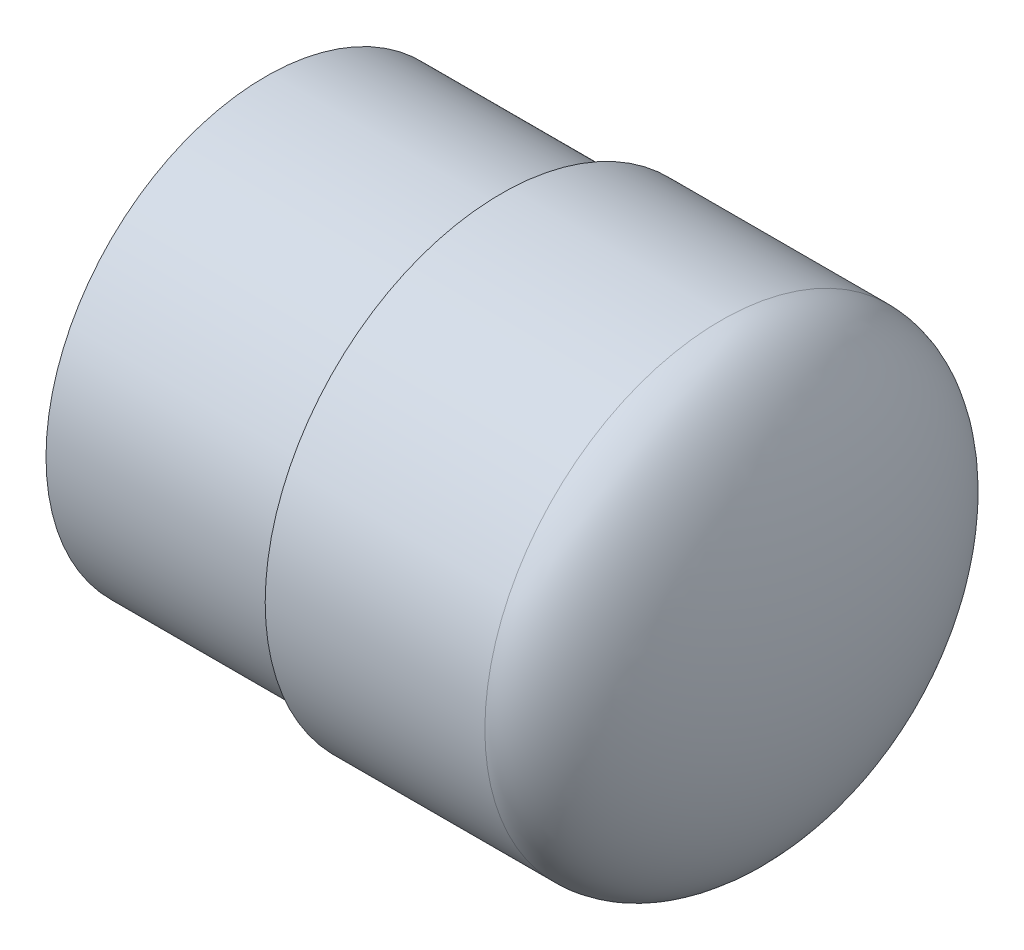
ISO-10303-21;
HEADER;
FILE_DESCRIPTION(('STEP AP214'),'2;1');
FILE_NAME('part.step','',(''),(''),'','','');
FILE_SCHEMA(('AUTOMOTIVE_DESIGN { 1 0 10303 214 1 1 1 1 }'));
ENDSEC;
DATA;
#1=APPLICATION_CONTEXT('core data for automotive mechanical design processes');
#2=APPLICATION_PROTOCOL_DEFINITION('international standard','automotive_design',2000,#1);
#3=PRODUCT_CONTEXT('',#1,'mechanical');
#4=PRODUCT('Part','Part','',(#3));
#5=PRODUCT_RELATED_PRODUCT_CATEGORY('part','',(#4));
#6=PRODUCT_DEFINITION_FORMATION('','',#4);
#7=PRODUCT_DEFINITION_CONTEXT('part definition',#1,'design');
#8=PRODUCT_DEFINITION('design','',#6,#7);
#9=PRODUCT_DEFINITION_SHAPE('','',#8);
#10=(LENGTH_UNIT() NAMED_UNIT(*) SI_UNIT(.MILLI.,.METRE.));
#11=(NAMED_UNIT(*) PLANE_ANGLE_UNIT() SI_UNIT($,.RADIAN.));
#12=(NAMED_UNIT(*) SI_UNIT($,.STERADIAN.) SOLID_ANGLE_UNIT());
#13=UNCERTAINTY_MEASURE_WITH_UNIT(LENGTH_MEASURE(1.E-05),#10,'distance_accuracy_value','');
#14=(GEOMETRIC_REPRESENTATION_CONTEXT(3) GLOBAL_UNCERTAINTY_ASSIGNED_CONTEXT((#13)) GLOBAL_UNIT_ASSIGNED_CONTEXT((#10,
#11,#12)) REPRESENTATION_CONTEXT('',''));
#15=CARTESIAN_POINT('',(0.,0.,0.));
#16=DIRECTION('',(0.,0.,1.));
#17=DIRECTION('',(1.,0.,0.));
#18=AXIS2_PLACEMENT_3D('',#15,#16,#17);
#19=CARTESIAN_POINT('',(-138.90625,-101.3587,0.));
#20=DIRECTION('',(-1.,0.,0.));
#21=DIRECTION('',(0.,0.,1.));
#22=AXIS2_PLACEMENT_3D('',#19,#20,#21);
#23=PLANE('',#22);
#24=CARTESIAN_POINT('',(-138.90625,0.,0.));
#25=DIRECTION('',(-1.,0.,0.));
#26=DIRECTION('',(0.,0.,1.));
#27=AXIS2_PLACEMENT_3D('',#24,#25,#26);
#28=CIRCLE('',#27,109.5375);
#29=CARTESIAN_POINT('',(-138.90625,0.,109.5375));
#30=VERTEX_POINT('',#29);
#31=EDGE_CURVE('E11',#30,#30,#28,.T.);
#32=ORIENTED_EDGE('',*,*,#31,.T.);
#33=EDGE_LOOP('',(#32));
#34=FACE_BOUND('',#33,.T.);
#35=CARTESIAN_POINT('',(-138.90625,0.,0.));
#36=DIRECTION('',(-1.,0.,0.));
#37=DIRECTION('',(0.,0.,1.));
#38=AXIS2_PLACEMENT_3D('',#35,#36,#37);
#39=CIRCLE('',#38,101.3587);
#40=CARTESIAN_POINT('',(-138.90625,0.,101.3587));
#41=VERTEX_POINT('',#40);
#42=EDGE_CURVE('E61',#41,#41,#39,.T.);
#43=ORIENTED_EDGE('',*,*,#42,.F.);
#44=EDGE_LOOP('',(#43));
#45=FACE_BOUND('',#44,.T.);
#46=ADVANCED_FACE('F32',(#34,#45),#23,.T.);
#47=CARTESIAN_POINT('',(-138.90625,0.,0.));
#48=DIRECTION('',(-1.,0.,0.));
#49=DIRECTION('',(0.,0.,1.));
#50=AXIS2_PLACEMENT_3D('',#47,#48,#49);
#51=CYLINDRICAL_SURFACE('',#50,109.5375);
#52=CARTESIAN_POINT('',(-21.43125,0.,0.));
#53=DIRECTION('',(-1.,0.,0.));
#54=DIRECTION('',(0.,0.,1.));
#55=AXIS2_PLACEMENT_3D('',#52,#53,#54);
#56=CIRCLE('',#55,109.5375);
#57=CARTESIAN_POINT('',(-21.43125,0.,109.5375));
#58=VERTEX_POINT('',#57);
#59=EDGE_CURVE('E39',#58,#58,#56,.T.);
#60=ORIENTED_EDGE('',*,*,#59,.T.);
#61=EDGE_LOOP('',(#60));
#62=FACE_BOUND('',#61,.T.);
#63=ORIENTED_EDGE('',*,*,#31,.F.);
#64=EDGE_LOOP('',(#63));
#65=FACE_BOUND('',#64,.T.);
#66=ADVANCED_FACE('F67',(#62,#65),#51,.T.);
#67=CARTESIAN_POINT('',(-21.43125,-109.5375,0.));
#68=DIRECTION('',(-1.,0.,0.));
#69=DIRECTION('',(0.,0.,1.));
#70=AXIS2_PLACEMENT_3D('',#67,#68,#69);
#71=PLANE('',#70);
#72=CARTESIAN_POINT('',(-21.43125,0.,0.));
#73=DIRECTION('',(-1.,0.,0.));
#74=DIRECTION('',(0.,0.,1.));
#75=AXIS2_PLACEMENT_3D('',#72,#73,#74);
#76=CIRCLE('',#75,117.7163);
#77=CARTESIAN_POINT('',(-21.43125,0.,117.7163));
#78=VERTEX_POINT('',#77);
#79=EDGE_CURVE('E55',#78,#78,#76,.T.);
#80=ORIENTED_EDGE('',*,*,#79,.T.);
#81=EDGE_LOOP('',(#80));
#82=FACE_BOUND('',#81,.T.);
#83=ORIENTED_EDGE('',*,*,#59,.F.);
#84=EDGE_LOOP('',(#83));
#85=FACE_BOUND('',#84,.T.);
#86=ADVANCED_FACE('F70',(#82,#85),#71,.T.);
#87=CARTESIAN_POINT('',(-138.90625,0.,0.));
#88=DIRECTION('',(-1.,0.,0.));
#89=DIRECTION('',(0.,0.,1.));
#90=AXIS2_PLACEMENT_3D('',#87,#88,#89);
#91=CYLINDRICAL_SURFACE('',#90,117.7163);
#92=CARTESIAN_POINT('',(88.10625,0.,0.));
#93=DIRECTION('',(-1.,0.,0.));
#94=DIRECTION('',(0.,0.,1.));
#95=AXIS2_PLACEMENT_3D('',#92,#93,#94);
#96=CIRCLE('',#95,117.7163);
#97=CARTESIAN_POINT('',(88.10625,0.,117.7163));
#98=VERTEX_POINT('',#97);
#99=EDGE_CURVE('E53',#98,#98,#96,.T.);
#100=ORIENTED_EDGE('',*,*,#99,.T.);
#101=EDGE_LOOP('',(#100));
#102=FACE_BOUND('',#101,.T.);
#103=ORIENTED_EDGE('',*,*,#79,.F.);
#104=EDGE_LOOP('',(#103));
#105=FACE_BOUND('',#104,.T.);
#106=ADVANCED_FACE('F49',(#102,#105),#91,.T.);
#107=CARTESIAN_POINT('',(88.10625,0.,0.));
#108=DIRECTION('',(0.,0.,1.));
#109=DIRECTION('',(0.,1.,0.));
#110=AXIS2_PLACEMENT_3D('',#107,#108,#109);
#111=ELLIPSE('',#110,117.7163,50.8);
#112=TRIMMED_CURVE('',#111,(PARAMETER_VALUE(1.5707963267949)),
(PARAMETER_VALUE(4.71238898038469)),.T.,.PARAMETER.);
#113=CARTESIAN_POINT('',(-138.90625,0.,0.));
#114=DIRECTION('',(-1.,0.,0.));
#115=AXIS1_PLACEMENT('',#113,#114);
#116=SURFACE_OF_REVOLUTION('',#112,#115);
#117=CARTESIAN_POINT('',(138.90625,0.,0.));
#118=VERTEX_POINT('',#117);
#119=VERTEX_LOOP('',#118);
#120=FACE_BOUND('',#119,.T.);
#121=ORIENTED_EDGE('',*,*,#99,.F.);
#122=EDGE_LOOP('',(#121));
#123=FACE_BOUND('',#122,.T.);
#124=ADVANCED_FACE('F45',(#120,#123),#116,.F.);
#125=CARTESIAN_POINT('',(88.10625,0.,0.));
#126=DIRECTION('',(0.,0.,-1.));
#127=DIRECTION('',(0.,-1.,0.));
#128=AXIS2_PLACEMENT_3D('',#125,#126,#127);
#129=ELLIPSE('',#128,101.3587,42.6212);
#130=TRIMMED_CURVE('',#129,(PARAMETER_VALUE(4.71238898038469)),
(PARAMETER_VALUE(7.85398163397448)),.T.,.PARAMETER.);
#131=CARTESIAN_POINT('',(-138.90625,0.,0.));
#132=DIRECTION('',(-1.,0.,0.));
#133=AXIS1_PLACEMENT('',#131,#132);
#134=SURFACE_OF_REVOLUTION('',#130,#133);
#135=CARTESIAN_POINT('',(88.10625,0.,0.));
#136=DIRECTION('',(-1.,0.,0.));
#137=DIRECTION('',(0.,0.,1.));
#138=AXIS2_PLACEMENT_3D('',#135,#136,#137);
#139=CIRCLE('',#138,101.3587);
#140=CARTESIAN_POINT('',(88.10625,0.,101.3587));
#141=VERTEX_POINT('',#140);
#142=EDGE_CURVE('E56',#141,#141,#139,.T.);
#143=ORIENTED_EDGE('',*,*,#142,.T.);
#144=EDGE_LOOP('',(#143));
#145=FACE_BOUND('',#144,.T.);
#146=CARTESIAN_POINT('',(130.72745,0.,0.));
#147=VERTEX_POINT('',#146);
#148=VERTEX_LOOP('',#147);
#149=FACE_BOUND('',#148,.T.);
#150=ADVANCED_FACE('F48',(#145,#149),#134,.F.);
#151=CARTESIAN_POINT('',(-138.90625,0.,0.));
#152=DIRECTION('',(-1.,0.,0.));
#153=DIRECTION('',(0.,0.,1.));
#154=AXIS2_PLACEMENT_3D('',#151,#152,#153);
#155=CYLINDRICAL_SURFACE('',#154,101.3587);
#156=ORIENTED_EDGE('',*,*,#42,.T.);
#157=EDGE_LOOP('',(#156));
#158=FACE_BOUND('',#157,.T.);
#159=ORIENTED_EDGE('',*,*,#142,.F.);
#160=EDGE_LOOP('',(#159));
#161=FACE_BOUND('',#160,.T.);
#162=ADVANCED_FACE('F95',(#158,#161),#155,.F.);
#163=CLOSED_SHELL('',(#46,#66,#86,#106,#124,#150,#162));
#164=MANIFOLD_SOLID_BREP('B2',#163);
#165=ADVANCED_BREP_SHAPE_REPRESENTATION('',(#18,#164),#14);
#166=SHAPE_DEFINITION_REPRESENTATION(#9,#165);
ENDSEC;
END-ISO-10303-21;
